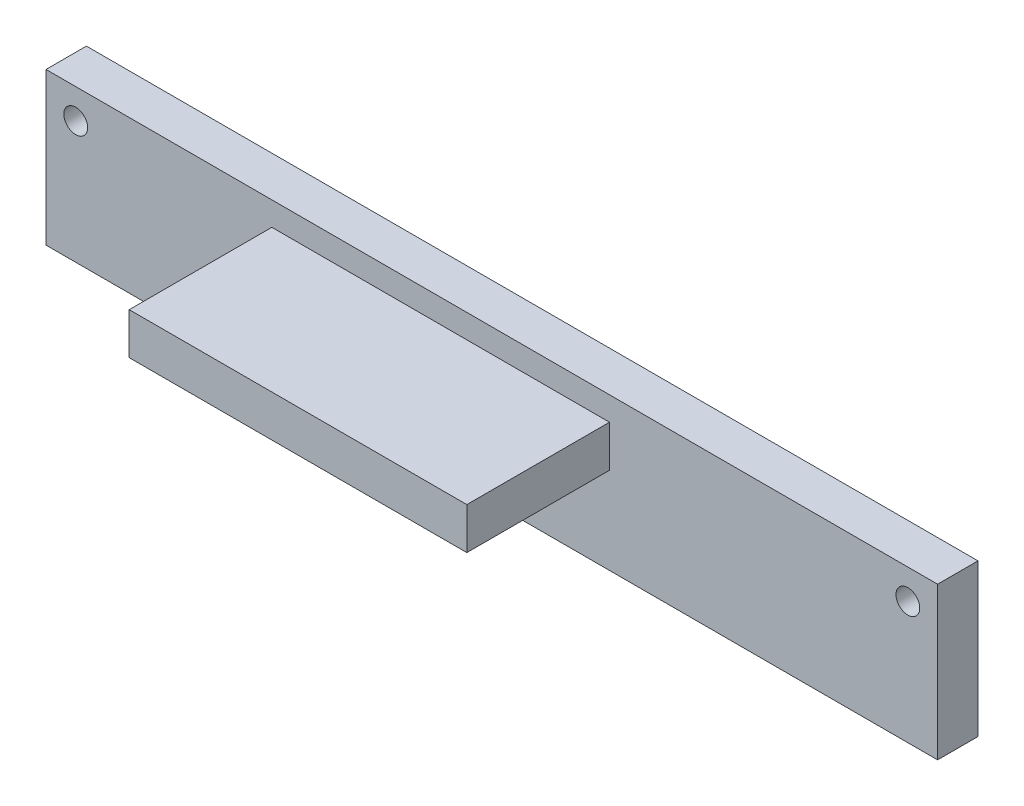
ISO-10303-21;
HEADER;
FILE_DESCRIPTION(('STEP AP214'),'2;1');
FILE_NAME('part.step','',(''),(''),'','','');
FILE_SCHEMA(('AUTOMOTIVE_DESIGN { 1 0 10303 214 1 1 1 1 }'));
ENDSEC;
DATA;
#1=APPLICATION_CONTEXT('core data for automotive mechanical design processes');
#2=APPLICATION_PROTOCOL_DEFINITION('international standard','automotive_design',2000,#1);
#3=PRODUCT_CONTEXT('',#1,'mechanical');
#4=PRODUCT('Part','Part','',(#3));
#5=PRODUCT_RELATED_PRODUCT_CATEGORY('part','',(#4));
#6=PRODUCT_DEFINITION_FORMATION('','',#4);
#7=PRODUCT_DEFINITION_CONTEXT('part definition',#1,'design');
#8=PRODUCT_DEFINITION('design','',#6,#7);
#9=PRODUCT_DEFINITION_SHAPE('','',#8);
#10=(LENGTH_UNIT() NAMED_UNIT(*) SI_UNIT(.MILLI.,.METRE.));
#11=(NAMED_UNIT(*) PLANE_ANGLE_UNIT() SI_UNIT($,.RADIAN.));
#12=(NAMED_UNIT(*) SI_UNIT($,.STERADIAN.) SOLID_ANGLE_UNIT());
#13=UNCERTAINTY_MEASURE_WITH_UNIT(LENGTH_MEASURE(1.E-05),#10,'distance_accuracy_value','');
#14=(GEOMETRIC_REPRESENTATION_CONTEXT(3) GLOBAL_UNCERTAINTY_ASSIGNED_CONTEXT((#13)) GLOBAL_UNIT_ASSIGNED_CONTEXT((#10,
#11,#12)) REPRESENTATION_CONTEXT('',''));
#15=CARTESIAN_POINT('',(0.,0.,0.));
#16=DIRECTION('',(0.,0.,1.));
#17=DIRECTION('',(1.,0.,0.));
#18=AXIS2_PLACEMENT_3D('',#15,#16,#17);
#19=CARTESIAN_POINT('',(0.,0.,3.4));
#20=DIRECTION('',(1.,0.,0.));
#21=DIRECTION('',(0.,0.,-1.));
#22=AXIS2_PLACEMENT_3D('',#19,#20,#21);
#23=PLANE('',#22);
#24=DIRECTION('',(0.,-1.,0.));
#25=VECTOR('',#24,1.);
#26=CARTESIAN_POINT('',(0.,0.,0.));
#27=LINE('',#26,#25);
#28=CARTESIAN_POINT('',(0.,12.8,0.));
#29=VERTEX_POINT('',#28);
#30=CARTESIAN_POINT('',(0.,0.,0.));
#31=VERTEX_POINT('',#30);
#32=EDGE_CURVE('E104',#29,#31,#27,.T.);
#33=ORIENTED_EDGE('',*,*,#32,.T.);
#34=DIRECTION('',(0.,0.,-1.));
#35=VECTOR('',#34,1.);
#36=CARTESIAN_POINT('',(0.,0.,3.4));
#37=LINE('',#36,#35);
#38=CARTESIAN_POINT('',(0.,0.,3.4));
#39=VERTEX_POINT('',#38);
#40=EDGE_CURVE('E11',#39,#31,#37,.T.);
#41=ORIENTED_EDGE('',*,*,#40,.F.);
#42=DIRECTION('',(0.,-1.,0.));
#43=VECTOR('',#42,1.);
#44=CARTESIAN_POINT('',(0.,0.,3.4));
#45=LINE('',#44,#43);
#46=CARTESIAN_POINT('',(0.,12.8,3.4));
#47=VERTEX_POINT('',#46);
#48=EDGE_CURVE('E136',#47,#39,#45,.T.);
#49=ORIENTED_EDGE('',*,*,#48,.F.);
#50=DIRECTION('',(0.,0.,-1.));
#51=VECTOR('',#50,1.);
#52=CARTESIAN_POINT('',(0.,12.8,3.4));
#53=LINE('',#52,#51);
#54=EDGE_CURVE('E146',#47,#29,#53,.T.);
#55=ORIENTED_EDGE('',*,*,#54,.T.);
#56=EDGE_LOOP('',(#33,#41,#49,#55));
#57=FACE_BOUND('',#56,.T.);
#58=ADVANCED_FACE('F31',(#57),#23,.F.);
#59=CARTESIAN_POINT('',(0.,0.,3.4));
#60=DIRECTION('',(0.,1.,0.));
#61=DIRECTION('',(0.,0.,1.));
#62=AXIS2_PLACEMENT_3D('',#59,#60,#61);
#63=PLANE('',#62);
#64=DIRECTION('',(1.,0.,0.));
#65=VECTOR('',#64,1.);
#66=CARTESIAN_POINT('',(0.,0.,0.));
#67=LINE('',#66,#65);
#68=CARTESIAN_POINT('',(75.,0.,0.));
#69=VERTEX_POINT('',#68);
#70=EDGE_CURVE('E149',#31,#69,#67,.T.);
#71=ORIENTED_EDGE('',*,*,#70,.T.);
#72=DIRECTION('',(0.,0.,-1.));
#73=VECTOR('',#72,1.);
#74=CARTESIAN_POINT('',(75.,0.,3.4));
#75=LINE('',#74,#73);
#76=CARTESIAN_POINT('',(75.,0.,3.4));
#77=VERTEX_POINT('',#76);
#78=EDGE_CURVE('E39',#77,#69,#75,.T.);
#79=ORIENTED_EDGE('',*,*,#78,.F.);
#80=DIRECTION('',(1.,0.,0.));
#81=VECTOR('',#80,1.);
#82=CARTESIAN_POINT('',(0.,0.,3.4));
#83=LINE('',#82,#81);
#84=EDGE_CURVE('E139',#39,#77,#83,.T.);
#85=ORIENTED_EDGE('',*,*,#84,.F.);
#86=ORIENTED_EDGE('',*,*,#40,.T.);
#87=EDGE_LOOP('',(#71,#79,#85,#86));
#88=FACE_BOUND('',#87,.T.);
#89=ADVANCED_FACE('F190',(#88),#63,.F.);
#90=CARTESIAN_POINT('',(75.,0.,3.4));
#91=DIRECTION('',(-1.,0.,0.));
#92=DIRECTION('',(0.,0.,1.));
#93=AXIS2_PLACEMENT_3D('',#90,#91,#92);
#94=PLANE('',#93);
#95=DIRECTION('',(0.,1.,0.));
#96=VECTOR('',#95,1.);
#97=CARTESIAN_POINT('',(75.,0.,0.));
#98=LINE('',#97,#96);
#99=CARTESIAN_POINT('',(75.,12.8,0.));
#100=VERTEX_POINT('',#99);
#101=EDGE_CURVE('E151',#69,#100,#98,.T.);
#102=ORIENTED_EDGE('',*,*,#101,.T.);
#103=DIRECTION('',(0.,0.,-1.));
#104=VECTOR('',#103,1.);
#105=CARTESIAN_POINT('',(75.,12.8,3.4));
#106=LINE('',#105,#104);
#107=CARTESIAN_POINT('',(75.,12.8,3.4));
#108=VERTEX_POINT('',#107);
#109=EDGE_CURVE('E156',#108,#100,#106,.T.);
#110=ORIENTED_EDGE('',*,*,#109,.F.);
#111=DIRECTION('',(0.,1.,0.));
#112=VECTOR('',#111,1.);
#113=CARTESIAN_POINT('',(75.,0.,3.4));
#114=LINE('',#113,#112);
#115=EDGE_CURVE('E142',#77,#108,#114,.T.);
#116=ORIENTED_EDGE('',*,*,#115,.F.);
#117=ORIENTED_EDGE('',*,*,#78,.T.);
#118=EDGE_LOOP('',(#102,#110,#116,#117));
#119=FACE_BOUND('',#118,.T.);
#120=ADVANCED_FACE('F195',(#119),#94,.F.);
#121=CARTESIAN_POINT('',(0.,12.8,3.4));
#122=DIRECTION('',(0.,-1.,0.));
#123=DIRECTION('',(0.,0.,-1.));
#124=AXIS2_PLACEMENT_3D('',#121,#122,#123);
#125=PLANE('',#124);
#126=DIRECTION('',(-1.,0.,0.));
#127=VECTOR('',#126,1.);
#128=CARTESIAN_POINT('',(0.,12.8,0.));
#129=LINE('',#128,#127);
#130=EDGE_CURVE('E140',#100,#29,#129,.T.);
#131=ORIENTED_EDGE('',*,*,#130,.T.);
#132=ORIENTED_EDGE('',*,*,#54,.F.);
#133=DIRECTION('',(-1.,0.,0.));
#134=VECTOR('',#133,1.);
#135=CARTESIAN_POINT('',(0.,12.8,3.4));
#136=LINE('',#135,#134);
#137=EDGE_CURVE('E144',#108,#47,#136,.T.);
#138=ORIENTED_EDGE('',*,*,#137,.F.);
#139=ORIENTED_EDGE('',*,*,#109,.T.);
#140=EDGE_LOOP('',(#131,#132,#138,#139));
#141=FACE_BOUND('',#140,.T.);
#142=ADVANCED_FACE('F179',(#141),#125,.F.);
#143=CARTESIAN_POINT('',(0.,12.8,3.4));
#144=DIRECTION('',(0.,0.,-1.));
#145=DIRECTION('',(-1.,0.,0.));
#146=AXIS2_PLACEMENT_3D('',#143,#144,#145);
#147=PLANE('',#146);
#148=CARTESIAN_POINT('',(2.5,10.3,3.4));
#149=DIRECTION('',(0.,0.,1.));
#150=DIRECTION('',(1.,0.,0.));
#151=AXIS2_PLACEMENT_3D('',#148,#149,#150);
#152=CIRCLE('',#151,1.00095972322757);
#153=CARTESIAN_POINT('',(3.50095972322757,10.3,3.4));
#154=VERTEX_POINT('',#153);
#155=EDGE_CURVE('E168',#154,#154,#152,.T.);
#156=ORIENTED_EDGE('',*,*,#155,.F.);
#157=EDGE_LOOP('',(#156));
#158=FACE_BOUND('',#157,.T.);
#159=CARTESIAN_POINT('',(72.5,10.3,3.4));
#160=DIRECTION('',(0.,0.,1.));
#161=DIRECTION('',(1.,0.,0.));
#162=AXIS2_PLACEMENT_3D('',#159,#160,#161);
#163=CIRCLE('',#162,0.999999999999998);
#164=CARTESIAN_POINT('',(73.5,10.3,3.4));
#165=VERTEX_POINT('',#164);
#166=EDGE_CURVE('E161',#165,#165,#163,.T.);
#167=ORIENTED_EDGE('',*,*,#166,.F.);
#168=EDGE_LOOP('',(#167));
#169=FACE_BOUND('',#168,.T.);
#170=DIRECTION('',(1.,0.,0.));
#171=VECTOR('',#170,1.);
#172=CARTESIAN_POINT('',(37.5,10.8,3.4));
#173=LINE('',#172,#171);
#174=CARTESIAN_POINT('',(19.,10.8,3.4));
#175=VERTEX_POINT('',#174);
#176=CARTESIAN_POINT('',(47.4,10.8,3.4));
#177=VERTEX_POINT('',#176);
#178=EDGE_CURVE('E47',#175,#177,#173,.T.);
#179=ORIENTED_EDGE('',*,*,#178,.T.);
#180=DIRECTION('',(0.,-1.,0.));
#181=VECTOR('',#180,1.);
#182=CARTESIAN_POINT('',(47.4000000000001,-52.9212168949175,3.4));
#183=LINE('',#182,#181);
#184=CARTESIAN_POINT('',(47.4,7.3,3.4));
#185=VERTEX_POINT('',#184);
#186=EDGE_CURVE('E101',#177,#185,#183,.T.);
#187=ORIENTED_EDGE('',*,*,#186,.T.);
#188=DIRECTION('',(1.,0.,0.));
#189=VECTOR('',#188,1.);
#190=CARTESIAN_POINT('',(37.5,7.3,3.4));
#191=LINE('',#190,#189);
#192=CARTESIAN_POINT('',(19.,7.3,3.4));
#193=VERTEX_POINT('',#192);
#194=EDGE_CURVE('E114',#193,#185,#191,.T.);
#195=ORIENTED_EDGE('',*,*,#194,.F.);
#196=DIRECTION('',(0.,-1.,0.));
#197=VECTOR('',#196,1.);
#198=CARTESIAN_POINT('',(18.9999999999999,-52.9212168949175,3.4));
#199=LINE('',#198,#197);
#200=EDGE_CURVE('E52',#175,#193,#199,.T.);
#201=ORIENTED_EDGE('',*,*,#200,.F.);
#202=EDGE_LOOP('',(#179,#187,#195,#201));
#203=FACE_BOUND('',#202,.T.);
#204=ORIENTED_EDGE('',*,*,#48,.T.);
#205=ORIENTED_EDGE('',*,*,#84,.T.);
#206=ORIENTED_EDGE('',*,*,#115,.T.);
#207=ORIENTED_EDGE('',*,*,#137,.T.);
#208=EDGE_LOOP('',(#204,#205,#206,#207));
#209=FACE_BOUND('',#208,.T.);
#210=ADVANCED_FACE('F175',(#158,#169,#203,#209),#147,.F.);
#211=CARTESIAN_POINT('',(0.,12.8,0.));
#212=DIRECTION('',(0.,0.,-1.));
#213=DIRECTION('',(-1.,0.,0.));
#214=AXIS2_PLACEMENT_3D('',#211,#212,#213);
#215=PLANE('',#214);
#216=CARTESIAN_POINT('',(2.5,10.3,0.));
#217=DIRECTION('',(0.,0.,-1.));
#218=DIRECTION('',(-1.,0.,0.));
#219=AXIS2_PLACEMENT_3D('',#216,#217,#218);
#220=CIRCLE('',#219,1.00095972322757);
#221=CARTESIAN_POINT('',(1.49904027677243,10.3,0.));
#222=VERTEX_POINT('',#221);
#223=EDGE_CURVE('E34',#222,#222,#220,.T.);
#224=ORIENTED_EDGE('',*,*,#223,.F.);
#225=EDGE_LOOP('',(#224));
#226=FACE_BOUND('',#225,.T.);
#227=CARTESIAN_POINT('',(72.5,10.3,0.));
#228=DIRECTION('',(0.,0.,-1.));
#229=DIRECTION('',(-1.,0.,0.));
#230=AXIS2_PLACEMENT_3D('',#227,#228,#229);
#231=CIRCLE('',#230,0.999999999999998);
#232=CARTESIAN_POINT('',(71.5,10.3,0.));
#233=VERTEX_POINT('',#232);
#234=EDGE_CURVE('E126',#233,#233,#231,.T.);
#235=ORIENTED_EDGE('',*,*,#234,.F.);
#236=EDGE_LOOP('',(#235));
#237=FACE_BOUND('',#236,.T.);
#238=ORIENTED_EDGE('',*,*,#32,.F.);
#239=ORIENTED_EDGE('',*,*,#130,.F.);
#240=ORIENTED_EDGE('',*,*,#101,.F.);
#241=ORIENTED_EDGE('',*,*,#70,.F.);
#242=EDGE_LOOP('',(#238,#239,#240,#241));
#243=FACE_BOUND('',#242,.T.);
#244=ADVANCED_FACE('F178',(#226,#237,#243),#215,.T.);
#245=CARTESIAN_POINT('',(47.4000000000001,-52.9212168949175,15.4));
#246=DIRECTION('',(1.,0.,0.));
#247=DIRECTION('',(0.,1.,0.));
#248=AXIS2_PLACEMENT_3D('',#245,#246,#247);
#249=PLANE('',#248);
#250=ORIENTED_EDGE('',*,*,#186,.F.);
#251=DIRECTION('',(0.,0.,-1.));
#252=VECTOR('',#251,1.);
#253=CARTESIAN_POINT('',(47.4,10.8,15.4));
#254=LINE('',#253,#252);
#255=CARTESIAN_POINT('',(47.4,10.8,15.4));
#256=VERTEX_POINT('',#255);
#257=EDGE_CURVE('E96',#256,#177,#254,.T.);
#258=ORIENTED_EDGE('',*,*,#257,.F.);
#259=DIRECTION('',(0.,-1.,0.));
#260=VECTOR('',#259,1.);
#261=CARTESIAN_POINT('',(47.4000000000001,-52.9212168949175,15.4));
#262=LINE('',#261,#260);
#263=CARTESIAN_POINT('',(47.4,7.3,15.4));
#264=VERTEX_POINT('',#263);
#265=EDGE_CURVE('E100',#256,#264,#262,.T.);
#266=ORIENTED_EDGE('',*,*,#265,.T.);
#267=DIRECTION('',(0.,0.,-1.));
#268=VECTOR('',#267,1.);
#269=CARTESIAN_POINT('',(47.4,7.3,15.4));
#270=LINE('',#269,#268);
#271=EDGE_CURVE('E124',#264,#185,#270,.T.);
#272=ORIENTED_EDGE('',*,*,#271,.T.);
#273=EDGE_LOOP('',(#250,#258,#266,#272));
#274=FACE_BOUND('',#273,.T.);
#275=ADVANCED_FACE('F98',(#274),#249,.T.);
#276=CARTESIAN_POINT('',(37.5,10.8,15.4));
#277=DIRECTION('',(0.,1.,0.));
#278=DIRECTION('',(0.,0.,1.));
#279=AXIS2_PLACEMENT_3D('',#276,#277,#278);
#280=PLANE('',#279);
#281=ORIENTED_EDGE('',*,*,#178,.F.);
#282=DIRECTION('',(0.,0.,-1.));
#283=VECTOR('',#282,1.);
#284=CARTESIAN_POINT('',(19.,10.8,15.4));
#285=LINE('',#284,#283);
#286=CARTESIAN_POINT('',(19.,10.8,15.4));
#287=VERTEX_POINT('',#286);
#288=EDGE_CURVE('E105',#287,#175,#285,.T.);
#289=ORIENTED_EDGE('',*,*,#288,.F.);
#290=DIRECTION('',(1.,0.,0.));
#291=VECTOR('',#290,1.);
#292=CARTESIAN_POINT('',(37.5,10.8,15.4));
#293=LINE('',#292,#291);
#294=EDGE_CURVE('E110',#287,#256,#293,.T.);
#295=ORIENTED_EDGE('',*,*,#294,.T.);
#296=ORIENTED_EDGE('',*,*,#257,.T.);
#297=EDGE_LOOP('',(#281,#289,#295,#296));
#298=FACE_BOUND('',#297,.T.);
#299=ADVANCED_FACE('F116',(#298),#280,.T.);
#300=CARTESIAN_POINT('',(18.9999999999999,-52.9212168949175,15.4));
#301=DIRECTION('',(1.,0.,0.));
#302=DIRECTION('',(0.,1.,0.));
#303=AXIS2_PLACEMENT_3D('',#300,#301,#302);
#304=PLANE('',#303);
#305=ORIENTED_EDGE('',*,*,#200,.T.);
#306=DIRECTION('',(0.,0.,-1.));
#307=VECTOR('',#306,1.);
#308=CARTESIAN_POINT('',(19.,7.3,15.4));
#309=LINE('',#308,#307);
#310=CARTESIAN_POINT('',(19.,7.3,15.4));
#311=VERTEX_POINT('',#310);
#312=EDGE_CURVE('E132',#311,#193,#309,.T.);
#313=ORIENTED_EDGE('',*,*,#312,.F.);
#314=DIRECTION('',(0.,-1.,0.));
#315=VECTOR('',#314,1.);
#316=CARTESIAN_POINT('',(18.9999999999999,-52.9212168949175,15.4));
#317=LINE('',#316,#315);
#318=EDGE_CURVE('E118',#287,#311,#317,.T.);
#319=ORIENTED_EDGE('',*,*,#318,.F.);
#320=ORIENTED_EDGE('',*,*,#288,.T.);
#321=EDGE_LOOP('',(#305,#313,#319,#320));
#322=FACE_BOUND('',#321,.T.);
#323=ADVANCED_FACE('F264',(#322),#304,.F.);
#324=CARTESIAN_POINT('',(37.5,7.3,15.4));
#325=DIRECTION('',(0.,1.,0.));
#326=DIRECTION('',(0.,0.,1.));
#327=AXIS2_PLACEMENT_3D('',#324,#325,#326);
#328=PLANE('',#327);
#329=ORIENTED_EDGE('',*,*,#194,.T.);
#330=ORIENTED_EDGE('',*,*,#271,.F.);
#331=DIRECTION('',(1.,0.,0.));
#332=VECTOR('',#331,1.);
#333=CARTESIAN_POINT('',(37.5,7.3,15.4));
#334=LINE('',#333,#332);
#335=EDGE_CURVE('E112',#311,#264,#334,.T.);
#336=ORIENTED_EDGE('',*,*,#335,.F.);
#337=ORIENTED_EDGE('',*,*,#312,.T.);
#338=EDGE_LOOP('',(#329,#330,#336,#337));
#339=FACE_BOUND('',#338,.T.);
#340=ADVANCED_FACE('F261',(#339),#328,.F.);
#341=CARTESIAN_POINT('',(37.5,-52.9212168949176,15.4));
#342=DIRECTION('',(0.,0.,1.));
#343=DIRECTION('',(1.,0.,0.));
#344=AXIS2_PLACEMENT_3D('',#341,#342,#343);
#345=PLANE('',#344);
#346=ORIENTED_EDGE('',*,*,#265,.F.);
#347=ORIENTED_EDGE('',*,*,#294,.F.);
#348=ORIENTED_EDGE('',*,*,#318,.T.);
#349=ORIENTED_EDGE('',*,*,#335,.T.);
#350=EDGE_LOOP('',(#346,#347,#348,#349));
#351=FACE_BOUND('',#350,.T.);
#352=ADVANCED_FACE('F109',(#351),#345,.T.);
#353=CARTESIAN_POINT('',(72.5,10.3,-8.6));
#354=DIRECTION('',(0.,0.,1.));
#355=DIRECTION('',(1.,0.,0.));
#356=AXIS2_PLACEMENT_3D('',#353,#354,#355);
#357=CYLINDRICAL_SURFACE('',#356,0.999999999999998);
#358=ORIENTED_EDGE('',*,*,#234,.T.);
#359=EDGE_LOOP('',(#358));
#360=FACE_BOUND('',#359,.T.);
#361=ORIENTED_EDGE('',*,*,#166,.T.);
#362=EDGE_LOOP('',(#361));
#363=FACE_BOUND('',#362,.T.);
#364=ADVANCED_FACE('F242',(#360,#363),#357,.F.);
#365=CARTESIAN_POINT('',(2.5,10.3,-8.6));
#366=DIRECTION('',(0.,0.,1.));
#367=DIRECTION('',(1.,0.,0.));
#368=AXIS2_PLACEMENT_3D('',#365,#366,#367);
#369=CYLINDRICAL_SURFACE('',#368,1.00095972322757);
#370=ORIENTED_EDGE('',*,*,#223,.T.);
#371=EDGE_LOOP('',(#370));
#372=FACE_BOUND('',#371,.T.);
#373=ORIENTED_EDGE('',*,*,#155,.T.);
#374=EDGE_LOOP('',(#373));
#375=FACE_BOUND('',#374,.T.);
#376=ADVANCED_FACE('F173',(#372,#375),#369,.F.);
#377=CLOSED_SHELL('',(#58,#89,#120,#142,#210,#244,#275,#299,#323,#340,#352,#364,#376));
#378=MANIFOLD_SOLID_BREP('B2',#377);
#379=ADVANCED_BREP_SHAPE_REPRESENTATION('',(#18,#378),#14);
#380=SHAPE_DEFINITION_REPRESENTATION(#9,#379);
ENDSEC;
END-ISO-10303-21;
